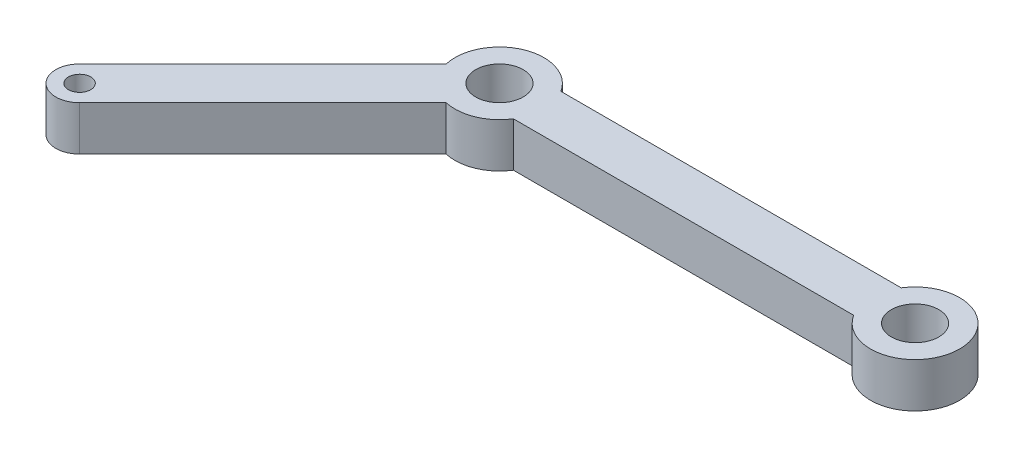
ISO-10303-21;
HEADER;
FILE_DESCRIPTION(('STEP AP214'),'2;1');
FILE_NAME('part.step','',(''),(''),'','','');
FILE_SCHEMA(('AUTOMOTIVE_DESIGN { 1 0 10303 214 1 1 1 1 }'));
ENDSEC;
DATA;
#1=APPLICATION_CONTEXT('core data for automotive mechanical design processes');
#2=APPLICATION_PROTOCOL_DEFINITION('international standard','automotive_design',2000,#1);
#3=PRODUCT_CONTEXT('',#1,'mechanical');
#4=PRODUCT('Part','Part','',(#3));
#5=PRODUCT_RELATED_PRODUCT_CATEGORY('part','',(#4));
#6=PRODUCT_DEFINITION_FORMATION('','',#4);
#7=PRODUCT_DEFINITION_CONTEXT('part definition',#1,'design');
#8=PRODUCT_DEFINITION('design','',#6,#7);
#9=PRODUCT_DEFINITION_SHAPE('','',#8);
#10=(LENGTH_UNIT() NAMED_UNIT(*) SI_UNIT(.MILLI.,.METRE.));
#11=(NAMED_UNIT(*) PLANE_ANGLE_UNIT() SI_UNIT($,.RADIAN.));
#12=(NAMED_UNIT(*) SI_UNIT($,.STERADIAN.) SOLID_ANGLE_UNIT());
#13=UNCERTAINTY_MEASURE_WITH_UNIT(LENGTH_MEASURE(1.E-05),#10,'distance_accuracy_value','');
#14=(GEOMETRIC_REPRESENTATION_CONTEXT(3) GLOBAL_UNCERTAINTY_ASSIGNED_CONTEXT((#13)) GLOBAL_UNIT_ASSIGNED_CONTEXT((#10,
#11,#12)) REPRESENTATION_CONTEXT('',''));
#15=CARTESIAN_POINT('',(0.,0.,0.));
#16=DIRECTION('',(0.,0.,1.));
#17=DIRECTION('',(1.,0.,0.));
#18=AXIS2_PLACEMENT_3D('',#15,#16,#17);
#19=CARTESIAN_POINT('',(0.,-3.,0.));
#20=DIRECTION('',(0.,1.,0.));
#21=DIRECTION('',(0.,0.,1.));
#22=AXIS2_PLACEMENT_3D('',#19,#20,#21);
#23=CYLINDRICAL_SURFACE('',#22,3.);
#24=CARTESIAN_POINT('',(0.,0.,0.));
#25=DIRECTION('',(0.,1.,0.));
#26=DIRECTION('',(0.,0.,1.));
#27=AXIS2_PLACEMENT_3D('',#24,#25,#26);
#28=CIRCLE('',#27,3.);
#29=CARTESIAN_POINT('',(-2.5377155080899,0.,1.6));
#30=VERTEX_POINT('',#29);
#31=CARTESIAN_POINT('',(-2.5377155080899,0.,-1.6));
#32=VERTEX_POINT('',#31);
#33=EDGE_CURVE('E133',#30,#32,#28,.T.);
#34=ORIENTED_EDGE('',*,*,#33,.F.);
#35=DIRECTION('',(0.,1.,0.));
#36=VECTOR('',#35,1.);
#37=CARTESIAN_POINT('',(-2.5377155080899,-3.,1.6));
#38=LINE('',#37,#36);
#39=CARTESIAN_POINT('',(-2.5377155080899,-3.,1.6));
#40=VERTEX_POINT('',#39);
#41=EDGE_CURVE('E11',#40,#30,#38,.T.);
#42=ORIENTED_EDGE('',*,*,#41,.F.);
#43=CARTESIAN_POINT('',(0.,-3.,0.));
#44=DIRECTION('',(0.,1.,0.));
#45=DIRECTION('',(0.,0.,1.));
#46=AXIS2_PLACEMENT_3D('',#43,#44,#45);
#47=CIRCLE('',#46,3.);
#48=CARTESIAN_POINT('',(-2.5377155080899,-3.,-1.6));
#49=VERTEX_POINT('',#48);
#50=EDGE_CURVE('E154',#40,#49,#47,.T.);
#51=ORIENTED_EDGE('',*,*,#50,.T.);
#52=DIRECTION('',(0.,1.,0.));
#53=VECTOR('',#52,1.);
#54=CARTESIAN_POINT('',(-2.5377155080899,-3.,-1.6));
#55=LINE('',#54,#53);
#56=EDGE_CURVE('E39',#49,#32,#55,.T.);
#57=ORIENTED_EDGE('',*,*,#56,.T.);
#58=EDGE_LOOP('',(#34,#42,#51,#57));
#59=FACE_BOUND('',#58,.T.);
#60=ADVANCED_FACE('F36',(#59),#23,.T.);
#61=CARTESIAN_POINT('',(-25.4622844919101,-3.,1.6));
#62=DIRECTION('',(0.,0.,1.));
#63=DIRECTION('',(1.,0.,0.));
#64=AXIS2_PLACEMENT_3D('',#61,#62,#63);
#65=PLANE('',#64);
#66=DIRECTION('',(1.,0.,0.));
#67=VECTOR('',#66,1.);
#68=CARTESIAN_POINT('',(-25.4622844919101,0.,1.6));
#69=LINE('',#68,#67);
#70=CARTESIAN_POINT('',(-25.4622844919101,0.,1.6));
#71=VERTEX_POINT('',#70);
#72=EDGE_CURVE('E152',#71,#30,#69,.T.);
#73=ORIENTED_EDGE('',*,*,#72,.F.);
#74=DIRECTION('',(0.,1.,0.));
#75=VECTOR('',#74,1.);
#76=CARTESIAN_POINT('',(-25.4622844919101,-3.,1.6));
#77=LINE('',#76,#75);
#78=CARTESIAN_POINT('',(-25.4622844919101,-3.,1.6));
#79=VERTEX_POINT('',#78);
#80=EDGE_CURVE('E45',#79,#71,#77,.T.);
#81=ORIENTED_EDGE('',*,*,#80,.F.);
#82=DIRECTION('',(1.,0.,0.));
#83=VECTOR('',#82,1.);
#84=CARTESIAN_POINT('',(-25.4622844919101,-3.,1.6));
#85=LINE('',#84,#83);
#86=EDGE_CURVE('E123',#79,#40,#85,.T.);
#87=ORIENTED_EDGE('',*,*,#86,.T.);
#88=ORIENTED_EDGE('',*,*,#41,.T.);
#89=EDGE_LOOP('',(#73,#81,#87,#88));
#90=FACE_BOUND('',#89,.T.);
#91=ADVANCED_FACE('F166',(#90),#65,.T.);
#92=CARTESIAN_POINT('',(-28.,-3.,0.));
#93=DIRECTION('',(0.,1.,0.));
#94=DIRECTION('',(0.,0.,1.));
#95=AXIS2_PLACEMENT_3D('',#92,#93,#94);
#96=CYLINDRICAL_SURFACE('',#95,3.);
#97=CARTESIAN_POINT('',(-28.,0.,0.));
#98=DIRECTION('',(0.,1.,0.));
#99=DIRECTION('',(0.,0.,1.));
#100=AXIS2_PLACEMENT_3D('',#97,#98,#99);
#101=CIRCLE('',#100,3.);
#102=CARTESIAN_POINT('',(-28.6630649945942,0.,2.92580669439111));
#103=VERTEX_POINT('',#102);
#104=EDGE_CURVE('E110',#103,#71,#101,.T.);
#105=ORIENTED_EDGE('',*,*,#104,.F.);
#106=DIRECTION('',(0.,1.,0.));
#107=VECTOR('',#106,1.);
#108=CARTESIAN_POINT('',(-28.6630649945942,-3.,2.92580669439111));
#109=LINE('',#108,#107);
#110=CARTESIAN_POINT('',(-28.6630649945942,-3.,2.92580669439111));
#111=VERTEX_POINT('',#110);
#112=EDGE_CURVE('E105',#111,#103,#109,.T.);
#113=ORIENTED_EDGE('',*,*,#112,.F.);
#114=CARTESIAN_POINT('',(-28.,-3.,0.));
#115=DIRECTION('',(0.,1.,0.));
#116=DIRECTION('',(0.,0.,1.));
#117=AXIS2_PLACEMENT_3D('',#114,#115,#116);
#118=CIRCLE('',#117,3.);
#119=EDGE_CURVE('E108',#111,#79,#118,.T.);
#120=ORIENTED_EDGE('',*,*,#119,.T.);
#121=ORIENTED_EDGE('',*,*,#80,.T.);
#122=EDGE_LOOP('',(#105,#113,#120,#121));
#123=FACE_BOUND('',#122,.T.);
#124=ADVANCED_FACE('F107',(#123),#96,.T.);
#125=CARTESIAN_POINT('',(-28.6630649945942,-3.,2.92580669439111));
#126=DIRECTION('',(0.707106781186544,0.,0.707106781186551));
#127=DIRECTION('',(0.707106781186551,0.,-0.707106781186544));
#128=AXIS2_PLACEMENT_3D('',#125,#126,#127);
#129=PLANE('',#128);
#130=DIRECTION('',(0.707106781186551,0.,-0.707106781186544));
#131=VECTOR('',#130,1.);
#132=CARTESIAN_POINT('',(-28.6630649945942,0.,2.92580669439111));
#133=LINE('',#132,#131);
#134=CARTESIAN_POINT('',(-41.0107647738325,0.,15.2735064736294));
#135=VERTEX_POINT('',#134);
#136=EDGE_CURVE('E149',#135,#103,#133,.T.);
#137=ORIENTED_EDGE('',*,*,#136,.F.);
#138=DIRECTION('',(0.,1.,0.));
#139=VECTOR('',#138,1.);
#140=CARTESIAN_POINT('',(-41.0107647738325,-3.,15.2735064736294));
#141=LINE('',#140,#139);
#142=CARTESIAN_POINT('',(-41.0107647738325,-3.,15.2735064736294));
#143=VERTEX_POINT('',#142);
#144=EDGE_CURVE('E115',#143,#135,#141,.T.);
#145=ORIENTED_EDGE('',*,*,#144,.F.);
#146=DIRECTION('',(0.707106781186551,0.,-0.707106781186544));
#147=VECTOR('',#146,1.);
#148=CARTESIAN_POINT('',(-28.6630649945942,-3.,2.92580669439111));
#149=LINE('',#148,#147);
#150=EDGE_CURVE('E121',#143,#111,#149,.T.);
#151=ORIENTED_EDGE('',*,*,#150,.T.);
#152=ORIENTED_EDGE('',*,*,#112,.T.);
#153=EDGE_LOOP('',(#137,#145,#151,#152));
#154=FACE_BOUND('',#153,.T.);
#155=ADVANCED_FACE('F125',(#154),#129,.T.);
#156=CARTESIAN_POINT('',(-42.142135623731,-3.,14.1421356237309));
#157=DIRECTION('',(0.,1.,0.));
#158=DIRECTION('',(0.,0.,1.));
#159=AXIS2_PLACEMENT_3D('',#156,#157,#158);
#160=CYLINDRICAL_SURFACE('',#159,1.6);
#161=CARTESIAN_POINT('',(-42.142135623731,0.,14.1421356237309));
#162=DIRECTION('',(0.,1.,0.));
#163=DIRECTION('',(0.,0.,1.));
#164=AXIS2_PLACEMENT_3D('',#161,#162,#163);
#165=CIRCLE('',#164,1.6);
#166=CARTESIAN_POINT('',(-43.2735064736295,0.,13.0107647738324));
#167=VERTEX_POINT('',#166);
#168=EDGE_CURVE('E146',#167,#135,#165,.T.);
#169=ORIENTED_EDGE('',*,*,#168,.F.);
#170=DIRECTION('',(0.,1.,0.));
#171=VECTOR('',#170,1.);
#172=CARTESIAN_POINT('',(-43.2735064736295,-3.,13.0107647738324));
#173=LINE('',#172,#171);
#174=CARTESIAN_POINT('',(-43.2735064736295,-3.,13.0107647738324));
#175=VERTEX_POINT('',#174);
#176=EDGE_CURVE('E158',#175,#167,#173,.T.);
#177=ORIENTED_EDGE('',*,*,#176,.F.);
#178=CARTESIAN_POINT('',(-42.142135623731,-3.,14.1421356237309));
#179=DIRECTION('',(0.,1.,0.));
#180=DIRECTION('',(0.,0.,1.));
#181=AXIS2_PLACEMENT_3D('',#178,#179,#180);
#182=CIRCLE('',#181,1.6);
#183=EDGE_CURVE('E126',#175,#143,#182,.T.);
#184=ORIENTED_EDGE('',*,*,#183,.T.);
#185=ORIENTED_EDGE('',*,*,#144,.T.);
#186=EDGE_LOOP('',(#169,#177,#184,#185));
#187=FACE_BOUND('',#186,.T.);
#188=ADVANCED_FACE('F179',(#187),#160,.T.);
#189=CARTESIAN_POINT('',(-43.2735064736295,-3.,13.0107647738324));
#190=DIRECTION('',(-0.707106781186543,0.,-0.707106781186552));
#191=DIRECTION('',(-0.707106781186552,0.,0.707106781186543));
#192=AXIS2_PLACEMENT_3D('',#189,#190,#191);
#193=PLANE('',#192);
#194=DIRECTION('',(-0.707106781186552,0.,0.707106781186543));
#195=VECTOR('',#194,1.);
#196=CARTESIAN_POINT('',(-43.2735064736295,0.,13.0107647738324));
#197=LINE('',#196,#195);
#198=CARTESIAN_POINT('',(-30.9258066943911,0.,0.663064994594151));
#199=VERTEX_POINT('',#198);
#200=EDGE_CURVE('E143',#199,#167,#197,.T.);
#201=ORIENTED_EDGE('',*,*,#200,.F.);
#202=DIRECTION('',(0.,1.,0.));
#203=VECTOR('',#202,1.);
#204=CARTESIAN_POINT('',(-30.9258066943911,-3.,0.663064994594151));
#205=LINE('',#204,#203);
#206=CARTESIAN_POINT('',(-30.9258066943911,-3.,0.663064994594151));
#207=VERTEX_POINT('',#206);
#208=EDGE_CURVE('E160',#207,#199,#205,.T.);
#209=ORIENTED_EDGE('',*,*,#208,.F.);
#210=DIRECTION('',(-0.707106781186552,0.,0.707106781186543));
#211=VECTOR('',#210,1.);
#212=CARTESIAN_POINT('',(-43.2735064736295,-3.,13.0107647738324));
#213=LINE('',#212,#211);
#214=EDGE_CURVE('E128',#207,#175,#213,.T.);
#215=ORIENTED_EDGE('',*,*,#214,.T.);
#216=ORIENTED_EDGE('',*,*,#176,.T.);
#217=EDGE_LOOP('',(#201,#209,#215,#216));
#218=FACE_BOUND('',#217,.T.);
#219=ADVANCED_FACE('F182',(#218),#193,.T.);
#220=CARTESIAN_POINT('',(-28.,-3.,0.));
#221=DIRECTION('',(0.,1.,0.));
#222=DIRECTION('',(0.,0.,1.));
#223=AXIS2_PLACEMENT_3D('',#220,#221,#222);
#224=CYLINDRICAL_SURFACE('',#223,3.);
#225=CARTESIAN_POINT('',(-28.,0.,0.));
#226=DIRECTION('',(0.,1.,0.));
#227=DIRECTION('',(0.,0.,1.));
#228=AXIS2_PLACEMENT_3D('',#225,#226,#227);
#229=CIRCLE('',#228,3.);
#230=CARTESIAN_POINT('',(-25.4622844919101,0.,-1.6));
#231=VERTEX_POINT('',#230);
#232=EDGE_CURVE('E140',#231,#199,#229,.T.);
#233=ORIENTED_EDGE('',*,*,#232,.F.);
#234=DIRECTION('',(0.,1.,0.));
#235=VECTOR('',#234,1.);
#236=CARTESIAN_POINT('',(-25.4622844919101,-3.,-1.6));
#237=LINE('',#236,#235);
#238=CARTESIAN_POINT('',(-25.4622844919101,-3.,-1.6));
#239=VERTEX_POINT('',#238);
#240=EDGE_CURVE('E161',#239,#231,#237,.T.);
#241=ORIENTED_EDGE('',*,*,#240,.F.);
#242=CARTESIAN_POINT('',(-28.,-3.,0.));
#243=DIRECTION('',(0.,1.,0.));
#244=DIRECTION('',(0.,0.,1.));
#245=AXIS2_PLACEMENT_3D('',#242,#243,#244);
#246=CIRCLE('',#245,3.);
#247=EDGE_CURVE('E238',#239,#207,#246,.T.);
#248=ORIENTED_EDGE('',*,*,#247,.T.);
#249=ORIENTED_EDGE('',*,*,#208,.T.);
#250=EDGE_LOOP('',(#233,#241,#248,#249));
#251=FACE_BOUND('',#250,.T.);
#252=ADVANCED_FACE('F186',(#251),#224,.T.);
#253=CARTESIAN_POINT('',(-25.4622844919101,-3.,-1.6));
#254=DIRECTION('',(0.,0.,-1.));
#255=DIRECTION('',(-1.,0.,0.));
#256=AXIS2_PLACEMENT_3D('',#253,#254,#255);
#257=PLANE('',#256);
#258=DIRECTION('',(-1.,0.,0.));
#259=VECTOR('',#258,1.);
#260=CARTESIAN_POINT('',(-25.4622844919101,0.,-1.6));
#261=LINE('',#260,#259);
#262=EDGE_CURVE('E136',#32,#231,#261,.T.);
#263=ORIENTED_EDGE('',*,*,#262,.F.);
#264=ORIENTED_EDGE('',*,*,#56,.F.);
#265=DIRECTION('',(-1.,0.,0.));
#266=VECTOR('',#265,1.);
#267=CARTESIAN_POINT('',(-25.4622844919101,-3.,-1.6));
#268=LINE('',#267,#266);
#269=EDGE_CURVE('E236',#49,#239,#268,.T.);
#270=ORIENTED_EDGE('',*,*,#269,.T.);
#271=ORIENTED_EDGE('',*,*,#240,.T.);
#272=EDGE_LOOP('',(#263,#264,#270,#271));
#273=FACE_BOUND('',#272,.T.);
#274=ADVANCED_FACE('F163',(#273),#257,.T.);
#275=CARTESIAN_POINT('',(0.,-3.,0.));
#276=DIRECTION('',(0.,1.,0.));
#277=DIRECTION('',(0.,0.,1.));
#278=AXIS2_PLACEMENT_3D('',#275,#276,#277);
#279=PLANE('',#278);
#280=CARTESIAN_POINT('',(-42.142135623731,-3.,14.1421356237309));
#281=DIRECTION('',(0.,1.,0.));
#282=DIRECTION('',(0.,0.,1.));
#283=AXIS2_PLACEMENT_3D('',#280,#281,#282);
#284=CIRCLE('',#283,0.750000000000004);
#285=CARTESIAN_POINT('',(-42.142135623731,-3.,14.8921356237309));
#286=VERTEX_POINT('',#285);
#287=EDGE_CURVE('E217',#286,#286,#284,.T.);
#288=ORIENTED_EDGE('',*,*,#287,.T.);
#289=EDGE_LOOP('',(#288));
#290=FACE_BOUND('',#289,.T.);
#291=CARTESIAN_POINT('',(-28.,-3.,0.));
#292=DIRECTION('',(0.,1.,0.));
#293=DIRECTION('',(0.,0.,1.));
#294=AXIS2_PLACEMENT_3D('',#291,#292,#293);
#295=CIRCLE('',#294,1.6);
#296=CARTESIAN_POINT('',(-28.,-3.,1.6));
#297=VERTEX_POINT('',#296);
#298=EDGE_CURVE('E225',#297,#297,#295,.T.);
#299=ORIENTED_EDGE('',*,*,#298,.T.);
#300=EDGE_LOOP('',(#299));
#301=FACE_BOUND('',#300,.T.);
#302=CARTESIAN_POINT('',(0.,-3.,0.));
#303=DIRECTION('',(0.,1.,0.));
#304=DIRECTION('',(0.,0.,1.));
#305=AXIS2_PLACEMENT_3D('',#302,#303,#304);
#306=CIRCLE('',#305,1.6);
#307=CARTESIAN_POINT('',(0.,-3.,1.6));
#308=VERTEX_POINT('',#307);
#309=EDGE_CURVE('E137',#308,#308,#306,.T.);
#310=ORIENTED_EDGE('',*,*,#309,.T.);
#311=EDGE_LOOP('',(#310));
#312=FACE_BOUND('',#311,.T.);
#313=ORIENTED_EDGE('',*,*,#50,.F.);
#314=ORIENTED_EDGE('',*,*,#86,.F.);
#315=ORIENTED_EDGE('',*,*,#119,.F.);
#316=ORIENTED_EDGE('',*,*,#150,.F.);
#317=ORIENTED_EDGE('',*,*,#183,.F.);
#318=ORIENTED_EDGE('',*,*,#214,.F.);
#319=ORIENTED_EDGE('',*,*,#247,.F.);
#320=ORIENTED_EDGE('',*,*,#269,.F.);
#321=EDGE_LOOP('',(#313,#314,#315,#316,#317,#318,#319,#320));
#322=FACE_BOUND('',#321,.T.);
#323=ADVANCED_FACE('F119',(#290,#301,#312,#322),#279,.F.);
#324=CARTESIAN_POINT('',(0.,0.,0.));
#325=DIRECTION('',(0.,1.,0.));
#326=DIRECTION('',(0.,0.,1.));
#327=AXIS2_PLACEMENT_3D('',#324,#325,#326);
#328=PLANE('',#327);
#329=CARTESIAN_POINT('',(-42.142135623731,0.,14.1421356237309));
#330=DIRECTION('',(0.,1.,0.));
#331=DIRECTION('',(0.,0.,1.));
#332=AXIS2_PLACEMENT_3D('',#329,#330,#331);
#333=CIRCLE('',#332,0.750000000000004);
#334=CARTESIAN_POINT('',(-42.142135623731,0.,14.8921356237309));
#335=VERTEX_POINT('',#334);
#336=EDGE_CURVE('E220',#335,#335,#333,.T.);
#337=ORIENTED_EDGE('',*,*,#336,.F.);
#338=EDGE_LOOP('',(#337));
#339=FACE_BOUND('',#338,.T.);
#340=CARTESIAN_POINT('',(-28.,0.,0.));
#341=DIRECTION('',(0.,1.,0.));
#342=DIRECTION('',(0.,0.,1.));
#343=AXIS2_PLACEMENT_3D('',#340,#341,#342);
#344=CIRCLE('',#343,1.6);
#345=CARTESIAN_POINT('',(-28.,0.,1.6));
#346=VERTEX_POINT('',#345);
#347=EDGE_CURVE('E222',#346,#346,#344,.T.);
#348=ORIENTED_EDGE('',*,*,#347,.F.);
#349=EDGE_LOOP('',(#348));
#350=FACE_BOUND('',#349,.T.);
#351=CARTESIAN_POINT('',(0.,0.,0.));
#352=DIRECTION('',(0.,1.,0.));
#353=DIRECTION('',(0.,0.,1.));
#354=AXIS2_PLACEMENT_3D('',#351,#352,#353);
#355=CIRCLE('',#354,1.6);
#356=CARTESIAN_POINT('',(0.,0.,1.6));
#357=VERTEX_POINT('',#356);
#358=EDGE_CURVE('E228',#357,#357,#355,.T.);
#359=ORIENTED_EDGE('',*,*,#358,.F.);
#360=EDGE_LOOP('',(#359));
#361=FACE_BOUND('',#360,.T.);
#362=ORIENTED_EDGE('',*,*,#33,.T.);
#363=ORIENTED_EDGE('',*,*,#262,.T.);
#364=ORIENTED_EDGE('',*,*,#232,.T.);
#365=ORIENTED_EDGE('',*,*,#200,.T.);
#366=ORIENTED_EDGE('',*,*,#168,.T.);
#367=ORIENTED_EDGE('',*,*,#136,.T.);
#368=ORIENTED_EDGE('',*,*,#104,.T.);
#369=ORIENTED_EDGE('',*,*,#72,.T.);
#370=EDGE_LOOP('',(#362,#363,#364,#365,#366,#367,#368,#369));
#371=FACE_BOUND('',#370,.T.);
#372=ADVANCED_FACE('F165',(#339,#350,#361,#371),#328,.T.);
#373=CARTESIAN_POINT('',(0.,-3.,0.));
#374=DIRECTION('',(0.,1.,0.));
#375=DIRECTION('',(0.,0.,1.));
#376=AXIS2_PLACEMENT_3D('',#373,#374,#375);
#377=CYLINDRICAL_SURFACE('',#376,1.6);
#378=ORIENTED_EDGE('',*,*,#309,.F.);
#379=EDGE_LOOP('',(#378));
#380=FACE_BOUND('',#379,.T.);
#381=ORIENTED_EDGE('',*,*,#358,.T.);
#382=EDGE_LOOP('',(#381));
#383=FACE_BOUND('',#382,.T.);
#384=ADVANCED_FACE('F198',(#380,#383),#377,.F.);
#385=CARTESIAN_POINT('',(-28.,-3.,0.));
#386=DIRECTION('',(0.,1.,0.));
#387=DIRECTION('',(0.,0.,1.));
#388=AXIS2_PLACEMENT_3D('',#385,#386,#387);
#389=CYLINDRICAL_SURFACE('',#388,1.6);
#390=ORIENTED_EDGE('',*,*,#298,.F.);
#391=EDGE_LOOP('',(#390));
#392=FACE_BOUND('',#391,.T.);
#393=ORIENTED_EDGE('',*,*,#347,.T.);
#394=EDGE_LOOP('',(#393));
#395=FACE_BOUND('',#394,.T.);
#396=ADVANCED_FACE('F205',(#392,#395),#389,.F.);
#397=CARTESIAN_POINT('',(-42.142135623731,-3.,14.1421356237309));
#398=DIRECTION('',(0.,1.,0.));
#399=DIRECTION('',(0.,0.,1.));
#400=AXIS2_PLACEMENT_3D('',#397,#398,#399);
#401=CYLINDRICAL_SURFACE('',#400,0.750000000000004);
#402=ORIENTED_EDGE('',*,*,#287,.F.);
#403=EDGE_LOOP('',(#402));
#404=FACE_BOUND('',#403,.T.);
#405=ORIENTED_EDGE('',*,*,#336,.T.);
#406=EDGE_LOOP('',(#405));
#407=FACE_BOUND('',#406,.T.);
#408=ADVANCED_FACE('F209',(#404,#407),#401,.F.);
#409=CLOSED_SHELL('',(#60,#91,#124,#155,#188,#219,#252,#274,#323,#372,#384,#396,#408));
#410=MANIFOLD_SOLID_BREP('B2',#409);
#411=ADVANCED_BREP_SHAPE_REPRESENTATION('',(#18,#410),#14);
#412=SHAPE_DEFINITION_REPRESENTATION(#9,#411);
ENDSEC;
END-ISO-10303-21;
